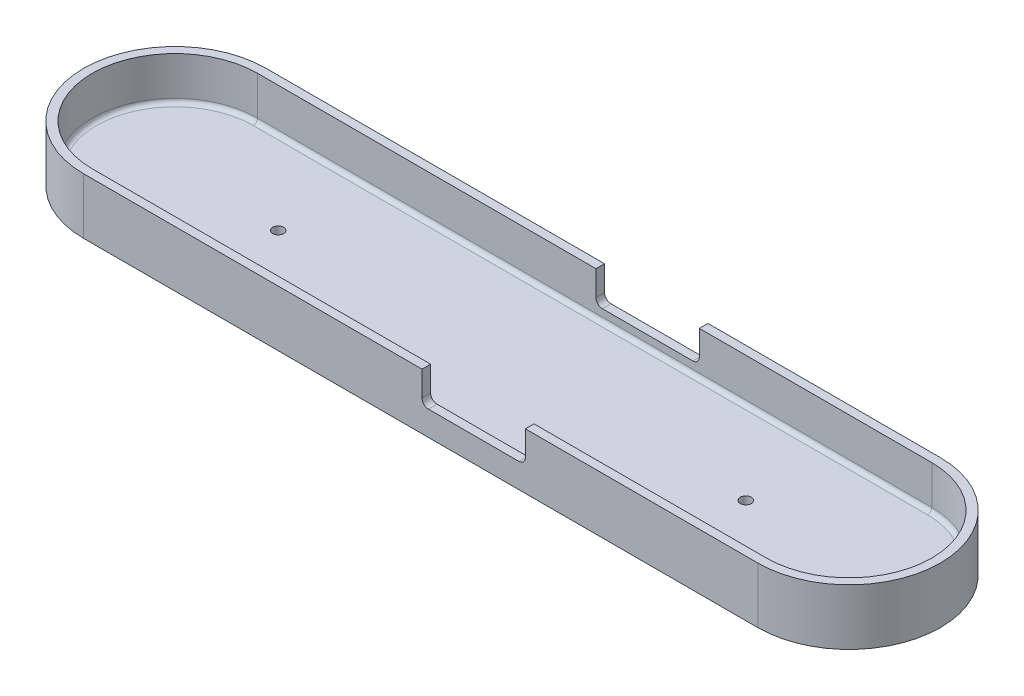
ISO-10303-21;
HEADER;
FILE_DESCRIPTION(('STEP AP214'),'2;1');
FILE_NAME('part.step','',(''),(''),'','','');
FILE_SCHEMA(('AUTOMOTIVE_DESIGN { 1 0 10303 214 1 1 1 1 }'));
ENDSEC;
DATA;
#1=APPLICATION_CONTEXT('core data for automotive mechanical design processes');
#2=APPLICATION_PROTOCOL_DEFINITION('international standard','automotive_design',2000,#1);
#3=PRODUCT_CONTEXT('',#1,'mechanical');
#4=PRODUCT('Part','Part','',(#3));
#5=PRODUCT_RELATED_PRODUCT_CATEGORY('part','',(#4));
#6=PRODUCT_DEFINITION_FORMATION('','',#4);
#7=PRODUCT_DEFINITION_CONTEXT('part definition',#1,'design');
#8=PRODUCT_DEFINITION('design','',#6,#7);
#9=PRODUCT_DEFINITION_SHAPE('','',#8);
#10=(LENGTH_UNIT() NAMED_UNIT(*) SI_UNIT(.MILLI.,.METRE.));
#11=(NAMED_UNIT(*) PLANE_ANGLE_UNIT() SI_UNIT($,.RADIAN.));
#12=(NAMED_UNIT(*) SI_UNIT($,.STERADIAN.) SOLID_ANGLE_UNIT());
#13=UNCERTAINTY_MEASURE_WITH_UNIT(LENGTH_MEASURE(1.E-05),#10,'distance_accuracy_value','');
#14=(GEOMETRIC_REPRESENTATION_CONTEXT(3) GLOBAL_UNCERTAINTY_ASSIGNED_CONTEXT((#13)) GLOBAL_UNIT_ASSIGNED_CONTEXT((#10,
#11,#12)) REPRESENTATION_CONTEXT('',''));
#15=CARTESIAN_POINT('',(0.,0.,0.));
#16=DIRECTION('',(0.,0.,1.));
#17=DIRECTION('',(1.,0.,0.));
#18=AXIS2_PLACEMENT_3D('',#15,#16,#17);
#19=CARTESIAN_POINT('',(-99.441,16.51,26.924));
#20=DIRECTION('',(0.,0.,1.));
#21=DIRECTION('',(1.,0.,0.));
#22=AXIS2_PLACEMENT_3D('',#19,#20,#21);
#23=PLANE('',#22);
#24=DIRECTION('',(0.,1.,0.));
#25=VECTOR('',#24,1.);
#26=CARTESIAN_POINT('',(30.861,7.239,26.924));
#27=LINE('',#26,#25);
#28=CARTESIAN_POINT('',(30.861,9.144,26.924));
#29=VERTEX_POINT('',#28);
#30=CARTESIAN_POINT('',(30.861,16.51,26.924));
#31=VERTEX_POINT('',#30);
#32=EDGE_CURVE('E196',#29,#31,#27,.T.);
#33=ORIENTED_EDGE('',*,*,#32,.F.);
#34=CARTESIAN_POINT('',(28.956,9.144,26.924));
#35=DIRECTION('',(0.,0.,1.));
#36=DIRECTION('',(1.,0.,0.));
#37=AXIS2_PLACEMENT_3D('',#34,#35,#36);
#38=CIRCLE('',#37,1.905);
#39=CARTESIAN_POINT('',(28.956,7.239,26.924));
#40=VERTEX_POINT('',#39);
#41=EDGE_CURVE('E334',#29,#40,#38,.F.);
#42=ORIENTED_EDGE('',*,*,#41,.T.);
#43=DIRECTION('',(-1.,0.,0.));
#44=VECTOR('',#43,1.);
#45=CARTESIAN_POINT('',(30.861,7.239,26.924));
#46=LINE('',#45,#44);
#47=CARTESIAN_POINT('',(2.28600000000001,7.239,26.924));
#48=VERTEX_POINT('',#47);
#49=EDGE_CURVE('E465',#40,#48,#46,.T.);
#50=ORIENTED_EDGE('',*,*,#49,.T.);
#51=CARTESIAN_POINT('',(2.28600000000001,9.144,26.924));
#52=DIRECTION('',(0.,0.,1.));
#53=DIRECTION('',(1.,0.,0.));
#54=AXIS2_PLACEMENT_3D('',#51,#52,#53);
#55=CIRCLE('',#54,1.905);
#56=CARTESIAN_POINT('',(0.381000000000006,9.144,26.924));
#57=VERTEX_POINT('',#56);
#58=EDGE_CURVE('E331',#48,#57,#55,.F.);
#59=ORIENTED_EDGE('',*,*,#58,.T.);
#60=DIRECTION('',(0.,1.,0.));
#61=VECTOR('',#60,1.);
#62=CARTESIAN_POINT('',(0.381000000000006,7.239,26.924));
#63=LINE('',#62,#61);
#64=CARTESIAN_POINT('',(0.381000000000006,16.51,26.924));
#65=VERTEX_POINT('',#64);
#66=EDGE_CURVE('E459',#57,#65,#63,.T.);
#67=ORIENTED_EDGE('',*,*,#66,.T.);
#68=DIRECTION('',(-1.,0.,0.));
#69=VECTOR('',#68,1.);
#70=CARTESIAN_POINT('',(-99.441,16.51,26.924));
#71=LINE('',#70,#69);
#72=CARTESIAN_POINT('',(-99.441,16.51,26.924));
#73=VERTEX_POINT('',#72);
#74=EDGE_CURVE('E226',#65,#73,#71,.T.);
#75=ORIENTED_EDGE('',*,*,#74,.T.);
#76=DIRECTION('',(0.,-1.,0.));
#77=VECTOR('',#76,1.);
#78=CARTESIAN_POINT('',(-99.441,16.51,26.924));
#79=LINE('',#78,#77);
#80=CARTESIAN_POINT('',(-99.441,0.,26.924));
#81=VERTEX_POINT('',#80);
#82=EDGE_CURVE('E254',#73,#81,#79,.T.);
#83=ORIENTED_EDGE('',*,*,#82,.T.);
#84=DIRECTION('',(-1.,0.,0.));
#85=VECTOR('',#84,1.);
#86=CARTESIAN_POINT('',(-99.441,0.,26.924));
#87=LINE('',#86,#85);
#88=CARTESIAN_POINT('',(99.441,0.,26.924));
#89=VERTEX_POINT('',#88);
#90=EDGE_CURVE('E249',#89,#81,#87,.T.);
#91=ORIENTED_EDGE('',*,*,#90,.F.);
#92=DIRECTION('',(0.,-1.,0.));
#93=VECTOR('',#92,1.);
#94=CARTESIAN_POINT('',(99.441,16.51,26.924));
#95=LINE('',#94,#93);
#96=CARTESIAN_POINT('',(99.441,16.51,26.924));
#97=VERTEX_POINT('',#96);
#98=EDGE_CURVE('E222',#97,#89,#95,.T.);
#99=ORIENTED_EDGE('',*,*,#98,.F.);
#100=EDGE_CURVE('E214',#97,#31,#71,.T.);
#101=ORIENTED_EDGE('',*,*,#100,.T.);
#102=EDGE_LOOP('',(#33,#42,#50,#59,#67,#75,#83,#91,#99,#101));
#103=FACE_BOUND('',#102,.T.);
#104=ADVANCED_FACE('F47',(#103),#23,.T.);
#105=CARTESIAN_POINT('',(-99.441,16.51,0.));
#106=DIRECTION('',(0.,-1.,0.));
#107=DIRECTION('',(0.,0.,-1.));
#108=AXIS2_PLACEMENT_3D('',#105,#106,#107);
#109=PLANE('',#108);
#110=DIRECTION('',(0.,0.,-1.));
#111=VECTOR('',#110,1.);
#112=CARTESIAN_POINT('',(0.381000000000006,16.51,26.924));
#113=LINE('',#112,#111);
#114=CARTESIAN_POINT('',(0.381000000000006,16.51,24.384));
#115=VERTEX_POINT('',#114);
#116=EDGE_CURVE('E219',#65,#115,#113,.T.);
#117=ORIENTED_EDGE('',*,*,#116,.T.);
#118=DIRECTION('',(-1.,0.,0.));
#119=VECTOR('',#118,1.);
#120=CARTESIAN_POINT('',(99.441,16.51,24.384));
#121=LINE('',#120,#119);
#122=CARTESIAN_POINT('',(-99.441,16.51,24.384));
#123=VERTEX_POINT('',#122);
#124=EDGE_CURVE('E413',#115,#123,#121,.T.);
#125=ORIENTED_EDGE('',*,*,#124,.T.);
#126=CARTESIAN_POINT('',(-99.441,16.51,0.));
#127=DIRECTION('',(0.,-1.,0.));
#128=DIRECTION('',(0.,0.,-1.));
#129=AXIS2_PLACEMENT_3D('',#126,#127,#128);
#130=CIRCLE('',#129,24.384);
#131=CARTESIAN_POINT('',(-99.441,16.51,-24.384));
#132=VERTEX_POINT('',#131);
#133=EDGE_CURVE('E402',#123,#132,#130,.T.);
#134=ORIENTED_EDGE('',*,*,#133,.T.);
#135=DIRECTION('',(1.,0.,0.));
#136=VECTOR('',#135,1.);
#137=CARTESIAN_POINT('',(99.441,16.51,-24.384));
#138=LINE('',#137,#136);
#139=CARTESIAN_POINT('',(0.381000000000006,16.51,-24.384));
#140=VERTEX_POINT('',#139);
#141=EDGE_CURVE('E407',#132,#140,#138,.T.);
#142=ORIENTED_EDGE('',*,*,#141,.T.);
#143=DIRECTION('',(0.,0.,1.));
#144=VECTOR('',#143,1.);
#145=CARTESIAN_POINT('',(0.381000000000006,16.51,-26.924));
#146=LINE('',#145,#144);
#147=CARTESIAN_POINT('',(0.381000000000006,16.51,-26.924));
#148=VERTEX_POINT('',#147);
#149=EDGE_CURVE('E376',#148,#140,#146,.T.);
#150=ORIENTED_EDGE('',*,*,#149,.F.);
#151=DIRECTION('',(1.,0.,0.));
#152=VECTOR('',#151,1.);
#153=CARTESIAN_POINT('',(-99.441,16.51,-26.924));
#154=LINE('',#153,#152);
#155=CARTESIAN_POINT('',(-99.441,16.51,-26.924));
#156=VERTEX_POINT('',#155);
#157=EDGE_CURVE('E434',#156,#148,#154,.T.);
#158=ORIENTED_EDGE('',*,*,#157,.F.);
#159=CARTESIAN_POINT('',(-99.441,16.51,0.));
#160=DIRECTION('',(0.,-1.,0.));
#161=DIRECTION('',(0.,0.,-1.));
#162=AXIS2_PLACEMENT_3D('',#159,#160,#161);
#163=CIRCLE('',#162,26.924);
#164=EDGE_CURVE('E253',#73,#156,#163,.T.);
#165=ORIENTED_EDGE('',*,*,#164,.F.);
#166=ORIENTED_EDGE('',*,*,#74,.F.);
#167=EDGE_LOOP('',(#117,#125,#134,#142,#150,#158,#165,#166));
#168=FACE_BOUND('',#167,.T.);
#169=ADVANCED_FACE('F454',(#168),#109,.F.);
#170=DIRECTION('',(0.,0.,1.));
#171=VECTOR('',#170,1.);
#172=CARTESIAN_POINT('',(30.861,16.51,24.384));
#173=LINE('',#172,#171);
#174=CARTESIAN_POINT('',(30.861,16.51,24.384));
#175=VERTEX_POINT('',#174);
#176=EDGE_CURVE('E200',#175,#31,#173,.T.);
#177=ORIENTED_EDGE('',*,*,#176,.T.);
#178=ORIENTED_EDGE('',*,*,#100,.F.);
#179=CARTESIAN_POINT('',(99.441,16.51,0.));
#180=DIRECTION('',(0.,-1.,0.));
#181=DIRECTION('',(0.,0.,1.));
#182=AXIS2_PLACEMENT_3D('',#179,#180,#181);
#183=CIRCLE('',#182,26.924);
#184=CARTESIAN_POINT('',(99.441,16.51,-26.924));
#185=VERTEX_POINT('',#184);
#186=EDGE_CURVE('E232',#185,#97,#183,.T.);
#187=ORIENTED_EDGE('',*,*,#186,.F.);
#188=CARTESIAN_POINT('',(30.861,16.51,-26.924));
#189=VERTEX_POINT('',#188);
#190=EDGE_CURVE('E433',#189,#185,#154,.T.);
#191=ORIENTED_EDGE('',*,*,#190,.F.);
#192=DIRECTION('',(0.,0.,-1.));
#193=VECTOR('',#192,1.);
#194=CARTESIAN_POINT('',(30.861,16.51,-24.384));
#195=LINE('',#194,#193);
#196=CARTESIAN_POINT('',(30.861,16.51,-24.384));
#197=VERTEX_POINT('',#196);
#198=EDGE_CURVE('E363',#197,#189,#195,.T.);
#199=ORIENTED_EDGE('',*,*,#198,.F.);
#200=CARTESIAN_POINT('',(99.441,16.51,-24.384));
#201=VERTEX_POINT('',#200);
#202=EDGE_CURVE('E406',#197,#201,#138,.T.);
#203=ORIENTED_EDGE('',*,*,#202,.T.);
#204=CARTESIAN_POINT('',(99.441,16.51,0.));
#205=DIRECTION('',(0.,-1.,0.));
#206=DIRECTION('',(0.,0.,1.));
#207=AXIS2_PLACEMENT_3D('',#204,#205,#206);
#208=CIRCLE('',#207,24.384);
#209=CARTESIAN_POINT('',(99.441,16.51,24.384));
#210=VERTEX_POINT('',#209);
#211=EDGE_CURVE('E410',#201,#210,#208,.T.);
#212=ORIENTED_EDGE('',*,*,#211,.T.);
#213=EDGE_CURVE('E217',#210,#175,#121,.T.);
#214=ORIENTED_EDGE('',*,*,#213,.T.);
#215=EDGE_LOOP('',(#177,#178,#187,#191,#199,#203,#212,#214));
#216=FACE_BOUND('',#215,.T.);
#217=ADVANCED_FACE('F212',(#216),#109,.F.);
#218=CARTESIAN_POINT('',(99.441,16.51,24.384));
#219=DIRECTION('',(0.,0.,1.));
#220=DIRECTION('',(1.,0.,0.));
#221=AXIS2_PLACEMENT_3D('',#218,#219,#220);
#222=PLANE('',#221);
#223=DIRECTION('',(0.,1.,0.));
#224=VECTOR('',#223,1.);
#225=CARTESIAN_POINT('',(0.381000000000006,7.239,24.384));
#226=LINE('',#225,#224);
#227=CARTESIAN_POINT('',(0.381000000000006,9.144,24.384));
#228=VERTEX_POINT('',#227);
#229=EDGE_CURVE('E470',#228,#115,#226,.T.);
#230=ORIENTED_EDGE('',*,*,#229,.F.);
#231=CARTESIAN_POINT('',(2.28600000000001,9.144,24.384));
#232=DIRECTION('',(0.,0.,1.));
#233=DIRECTION('',(1.,0.,0.));
#234=AXIS2_PLACEMENT_3D('',#231,#232,#233);
#235=CIRCLE('',#234,1.905);
#236=CARTESIAN_POINT('',(2.28600000000001,7.239,24.384));
#237=VERTEX_POINT('',#236);
#238=EDGE_CURVE('E328',#228,#237,#235,.T.);
#239=ORIENTED_EDGE('',*,*,#238,.T.);
#240=DIRECTION('',(1.,0.,0.));
#241=VECTOR('',#240,1.);
#242=CARTESIAN_POINT('',(0.381000000000006,7.239,24.384));
#243=LINE('',#242,#241);
#244=CARTESIAN_POINT('',(28.956,7.239,24.384));
#245=VERTEX_POINT('',#244);
#246=EDGE_CURVE('E208',#237,#245,#243,.T.);
#247=ORIENTED_EDGE('',*,*,#246,.T.);
#248=CARTESIAN_POINT('',(28.956,9.144,24.384));
#249=DIRECTION('',(0.,0.,1.));
#250=DIRECTION('',(1.,0.,0.));
#251=AXIS2_PLACEMENT_3D('',#248,#249,#250);
#252=CIRCLE('',#251,1.905);
#253=CARTESIAN_POINT('',(30.861,9.144,24.384));
#254=VERTEX_POINT('',#253);
#255=EDGE_CURVE('E337',#245,#254,#252,.T.);
#256=ORIENTED_EDGE('',*,*,#255,.T.);
#257=DIRECTION('',(0.,1.,0.));
#258=VECTOR('',#257,1.);
#259=CARTESIAN_POINT('',(30.861,7.239,24.384));
#260=LINE('',#259,#258);
#261=EDGE_CURVE('E207',#254,#175,#260,.T.);
#262=ORIENTED_EDGE('',*,*,#261,.T.);
#263=ORIENTED_EDGE('',*,*,#213,.F.);
#264=DIRECTION('',(0.,-1.,0.));
#265=VECTOR('',#264,1.);
#266=CARTESIAN_POINT('',(99.441,16.51,24.384));
#267=LINE('',#266,#265);
#268=CARTESIAN_POINT('',(99.441,5.08,24.384));
#269=VERTEX_POINT('',#268);
#270=EDGE_CURVE('E420',#210,#269,#267,.T.);
#271=ORIENTED_EDGE('',*,*,#270,.T.);
#272=DIRECTION('',(1.,0.,0.));
#273=VECTOR('',#272,1.);
#274=CARTESIAN_POINT('',(99.441,5.08,24.384));
#275=LINE('',#274,#273);
#276=CARTESIAN_POINT('',(-99.441,5.08,24.384));
#277=VERTEX_POINT('',#276);
#278=EDGE_CURVE('E278',#269,#277,#275,.F.);
#279=ORIENTED_EDGE('',*,*,#278,.T.);
#280=DIRECTION('',(0.,-1.,0.));
#281=VECTOR('',#280,1.);
#282=CARTESIAN_POINT('',(-99.441,16.51,24.384));
#283=LINE('',#282,#281);
#284=EDGE_CURVE('E241',#123,#277,#283,.T.);
#285=ORIENTED_EDGE('',*,*,#284,.F.);
#286=ORIENTED_EDGE('',*,*,#124,.F.);
#287=EDGE_LOOP('',(#230,#239,#247,#256,#262,#263,#271,#279,#285,#286));
#288=FACE_BOUND('',#287,.T.);
#289=ADVANCED_FACE('F469',(#288),#222,.F.);
#290=CARTESIAN_POINT('',(-99.441,3.81,0.));
#291=DIRECTION('',(0.,1.,0.));
#292=DIRECTION('',(0.,0.,1.));
#293=AXIS2_PLACEMENT_3D('',#290,#291,#292);
#294=PLANE('',#293);
#295=DIRECTION('',(1.,0.,0.));
#296=VECTOR('',#295,1.);
#297=CARTESIAN_POINT('',(-99.441,3.81,23.114));
#298=LINE('',#297,#296);
#299=CARTESIAN_POINT('',(-99.441,3.81,23.114));
#300=VERTEX_POINT('',#299);
#301=CARTESIAN_POINT('',(99.441,3.81,23.114));
#302=VERTEX_POINT('',#301);
#303=EDGE_CURVE('E267',#300,#302,#298,.T.);
#304=ORIENTED_EDGE('',*,*,#303,.T.);
#305=CARTESIAN_POINT('',(99.441,3.81,0.));
#306=DIRECTION('',(0.,1.,0.));
#307=DIRECTION('',(0.,0.,1.));
#308=AXIS2_PLACEMENT_3D('',#305,#306,#307);
#309=CIRCLE('',#308,23.114);
#310=CARTESIAN_POINT('',(99.441,3.81,-23.114));
#311=VERTEX_POINT('',#310);
#312=EDGE_CURVE('E270',#302,#311,#309,.T.);
#313=ORIENTED_EDGE('',*,*,#312,.T.);
#314=DIRECTION('',(-1.,0.,0.));
#315=VECTOR('',#314,1.);
#316=CARTESIAN_POINT('',(-99.441,3.81,-23.114));
#317=LINE('',#316,#315);
#318=CARTESIAN_POINT('',(-99.441,3.81,-23.114));
#319=VERTEX_POINT('',#318);
#320=EDGE_CURVE('E257',#311,#319,#317,.T.);
#321=ORIENTED_EDGE('',*,*,#320,.T.);
#322=CARTESIAN_POINT('',(-99.441,3.81,0.));
#323=DIRECTION('',(0.,1.,0.));
#324=DIRECTION('',(0.,0.,1.));
#325=AXIS2_PLACEMENT_3D('',#322,#323,#324);
#326=CIRCLE('',#325,23.114);
#327=EDGE_CURVE('E264',#319,#300,#326,.T.);
#328=ORIENTED_EDGE('',*,*,#327,.T.);
#329=EDGE_LOOP('',(#304,#313,#321,#328));
#330=FACE_BOUND('',#329,.T.);
#331=CARTESIAN_POINT('',(-68.961,3.81,0.));
#332=DIRECTION('',(0.,1.,0.));
#333=DIRECTION('',(0.,0.,1.));
#334=AXIS2_PLACEMENT_3D('',#331,#332,#333);
#335=CIRCLE('',#334,1.6256);
#336=CARTESIAN_POINT('',(-68.961,3.81,1.6256));
#337=VERTEX_POINT('',#336);
#338=EDGE_CURVE('E398',#337,#337,#335,.T.);
#339=ORIENTED_EDGE('',*,*,#338,.F.);
#340=EDGE_LOOP('',(#339));
#341=FACE_BOUND('',#340,.T.);
#342=CARTESIAN_POINT('',(68.961,3.81,0.));
#343=DIRECTION('',(0.,1.,0.));
#344=DIRECTION('',(0.,0.,1.));
#345=AXIS2_PLACEMENT_3D('',#342,#343,#344);
#346=CIRCLE('',#345,1.6256);
#347=CARTESIAN_POINT('',(68.961,3.81,1.6256));
#348=VERTEX_POINT('',#347);
#349=EDGE_CURVE('E391',#348,#348,#346,.T.);
#350=ORIENTED_EDGE('',*,*,#349,.F.);
#351=EDGE_LOOP('',(#350));
#352=FACE_BOUND('',#351,.T.);
#353=ADVANCED_FACE('F529',(#330,#341,#352),#294,.T.);
#354=CARTESIAN_POINT('',(-99.441,16.51,0.));
#355=DIRECTION('',(0.,-1.,0.));
#356=DIRECTION('',(0.,0.,-1.));
#357=AXIS2_PLACEMENT_3D('',#354,#355,#356);
#358=CYLINDRICAL_SURFACE('',#357,26.924);
#359=CARTESIAN_POINT('',(-99.441,0.,0.));
#360=DIRECTION('',(0.,-1.,0.));
#361=DIRECTION('',(0.,0.,-1.));
#362=AXIS2_PLACEMENT_3D('',#359,#360,#361);
#363=CIRCLE('',#362,26.924);
#364=CARTESIAN_POINT('',(-99.441,0.,-26.924));
#365=VERTEX_POINT('',#364);
#366=EDGE_CURVE('E236',#81,#365,#363,.T.);
#367=ORIENTED_EDGE('',*,*,#366,.F.);
#368=ORIENTED_EDGE('',*,*,#82,.F.);
#369=ORIENTED_EDGE('',*,*,#164,.T.);
#370=DIRECTION('',(0.,-1.,0.));
#371=VECTOR('',#370,1.);
#372=CARTESIAN_POINT('',(-99.441,16.51,-26.924));
#373=LINE('',#372,#371);
#374=EDGE_CURVE('E225',#156,#365,#373,.T.);
#375=ORIENTED_EDGE('',*,*,#374,.T.);
#376=EDGE_LOOP('',(#367,#368,#369,#375));
#377=FACE_BOUND('',#376,.T.);
#378=ADVANCED_FACE('F457',(#377),#358,.T.);
#379=CARTESIAN_POINT('',(99.441,16.51,0.));
#380=DIRECTION('',(0.,-1.,0.));
#381=DIRECTION('',(0.,0.,-1.));
#382=AXIS2_PLACEMENT_3D('',#379,#380,#381);
#383=CYLINDRICAL_SURFACE('',#382,26.924);
#384=CARTESIAN_POINT('',(99.441,0.,0.));
#385=DIRECTION('',(0.,-1.,0.));
#386=DIRECTION('',(0.,0.,1.));
#387=AXIS2_PLACEMENT_3D('',#384,#385,#386);
#388=CIRCLE('',#387,26.924);
#389=CARTESIAN_POINT('',(99.441,0.,-26.924));
#390=VERTEX_POINT('',#389);
#391=EDGE_CURVE('E245',#390,#89,#388,.T.);
#392=ORIENTED_EDGE('',*,*,#391,.F.);
#393=DIRECTION('',(0.,-1.,0.));
#394=VECTOR('',#393,1.);
#395=CARTESIAN_POINT('',(99.441,16.51,-26.924));
#396=LINE('',#395,#394);
#397=EDGE_CURVE('E230',#185,#390,#396,.T.);
#398=ORIENTED_EDGE('',*,*,#397,.F.);
#399=ORIENTED_EDGE('',*,*,#186,.T.);
#400=ORIENTED_EDGE('',*,*,#98,.T.);
#401=EDGE_LOOP('',(#392,#398,#399,#400));
#402=FACE_BOUND('',#401,.T.);
#403=ADVANCED_FACE('F446',(#402),#383,.T.);
#404=CARTESIAN_POINT('',(-99.441,16.51,-26.924));
#405=DIRECTION('',(0.,0.,-1.));
#406=DIRECTION('',(-1.,0.,0.));
#407=AXIS2_PLACEMENT_3D('',#404,#405,#406);
#408=PLANE('',#407);
#409=DIRECTION('',(-1.,0.,0.));
#410=VECTOR('',#409,1.);
#411=CARTESIAN_POINT('',(30.861,7.239,-26.924));
#412=LINE('',#411,#410);
#413=CARTESIAN_POINT('',(28.956,7.239,-26.924));
#414=VERTEX_POINT('',#413);
#415=CARTESIAN_POINT('',(2.28600000000001,7.239,-26.924));
#416=VERTEX_POINT('',#415);
#417=EDGE_CURVE('E350',#414,#416,#412,.T.);
#418=ORIENTED_EDGE('',*,*,#417,.F.);
#419=CARTESIAN_POINT('',(28.956,9.144,-26.924));
#420=DIRECTION('',(0.,0.,-1.));
#421=DIRECTION('',(-1.,0.,0.));
#422=AXIS2_PLACEMENT_3D('',#419,#420,#421);
#423=CIRCLE('',#422,1.905);
#424=CARTESIAN_POINT('',(30.861,9.144,-26.924));
#425=VERTEX_POINT('',#424);
#426=EDGE_CURVE('E56',#414,#425,#423,.F.);
#427=ORIENTED_EDGE('',*,*,#426,.T.);
#428=DIRECTION('',(0.,1.,0.));
#429=VECTOR('',#428,1.);
#430=CARTESIAN_POINT('',(30.861,7.239,-26.924));
#431=LINE('',#430,#429);
#432=EDGE_CURVE('E292',#425,#189,#431,.T.);
#433=ORIENTED_EDGE('',*,*,#432,.T.);
#434=ORIENTED_EDGE('',*,*,#190,.T.);
#435=ORIENTED_EDGE('',*,*,#397,.T.);
#436=DIRECTION('',(1.,0.,0.));
#437=VECTOR('',#436,1.);
#438=CARTESIAN_POINT('',(-99.441,0.,-26.924));
#439=LINE('',#438,#437);
#440=EDGE_CURVE('E240',#365,#390,#439,.T.);
#441=ORIENTED_EDGE('',*,*,#440,.F.);
#442=ORIENTED_EDGE('',*,*,#374,.F.);
#443=ORIENTED_EDGE('',*,*,#157,.T.);
#444=DIRECTION('',(0.,1.,0.));
#445=VECTOR('',#444,1.);
#446=CARTESIAN_POINT('',(0.381000000000006,7.239,-26.924));
#447=LINE('',#446,#445);
#448=CARTESIAN_POINT('',(0.381000000000006,9.144,-26.924));
#449=VERTEX_POINT('',#448);
#450=EDGE_CURVE('E352',#449,#148,#447,.T.);
#451=ORIENTED_EDGE('',*,*,#450,.F.);
#452=CARTESIAN_POINT('',(2.28600000000001,9.144,-26.924));
#453=DIRECTION('',(0.,0.,-1.));
#454=DIRECTION('',(-1.,0.,0.));
#455=AXIS2_PLACEMENT_3D('',#452,#453,#454);
#456=CIRCLE('',#455,1.905);
#457=EDGE_CURVE('E343',#449,#416,#456,.F.);
#458=ORIENTED_EDGE('',*,*,#457,.T.);
#459=EDGE_LOOP('',(#418,#427,#433,#434,#435,#441,#442,#443,#451,#458));
#460=FACE_BOUND('',#459,.T.);
#461=ADVANCED_FACE('F349',(#460),#408,.T.);
#462=CARTESIAN_POINT('',(-99.441,16.51,0.));
#463=DIRECTION('',(0.,-1.,0.));
#464=DIRECTION('',(0.,0.,-1.));
#465=AXIS2_PLACEMENT_3D('',#462,#463,#464);
#466=CYLINDRICAL_SURFACE('',#465,24.384);
#467=ORIENTED_EDGE('',*,*,#284,.T.);
#468=CARTESIAN_POINT('',(-99.441,5.08,0.));
#469=DIRECTION('',(0.,1.,0.));
#470=DIRECTION('',(0.,0.,1.));
#471=AXIS2_PLACEMENT_3D('',#468,#469,#470);
#472=CIRCLE('',#471,24.384);
#473=CARTESIAN_POINT('',(-99.441,5.08,-24.384));
#474=VERTEX_POINT('',#473);
#475=EDGE_CURVE('E281',#277,#474,#472,.F.);
#476=ORIENTED_EDGE('',*,*,#475,.T.);
#477=DIRECTION('',(0.,-1.,0.));
#478=VECTOR('',#477,1.);
#479=CARTESIAN_POINT('',(-99.441,16.51,-24.384));
#480=LINE('',#479,#478);
#481=EDGE_CURVE('E416',#132,#474,#480,.T.);
#482=ORIENTED_EDGE('',*,*,#481,.F.);
#483=ORIENTED_EDGE('',*,*,#133,.F.);
#484=EDGE_LOOP('',(#467,#476,#482,#483));
#485=FACE_BOUND('',#484,.T.);
#486=ADVANCED_FACE('F526',(#485),#466,.F.);
#487=CARTESIAN_POINT('',(99.441,16.51,0.));
#488=DIRECTION('',(0.,-1.,0.));
#489=DIRECTION('',(0.,0.,-1.));
#490=AXIS2_PLACEMENT_3D('',#487,#488,#489);
#491=CYLINDRICAL_SURFACE('',#490,24.384);
#492=DIRECTION('',(0.,-1.,0.));
#493=VECTOR('',#492,1.);
#494=CARTESIAN_POINT('',(99.441,16.51,-24.384));
#495=LINE('',#494,#493);
#496=CARTESIAN_POINT('',(99.441,5.08,-24.384));
#497=VERTEX_POINT('',#496);
#498=EDGE_CURVE('E424',#201,#497,#495,.T.);
#499=ORIENTED_EDGE('',*,*,#498,.T.);
#500=CARTESIAN_POINT('',(99.441,5.08,0.));
#501=DIRECTION('',(0.,1.,0.));
#502=DIRECTION('',(0.,0.,1.));
#503=AXIS2_PLACEMENT_3D('',#500,#501,#502);
#504=CIRCLE('',#503,24.384);
#505=EDGE_CURVE('E274',#497,#269,#504,.F.);
#506=ORIENTED_EDGE('',*,*,#505,.T.);
#507=ORIENTED_EDGE('',*,*,#270,.F.);
#508=ORIENTED_EDGE('',*,*,#211,.F.);
#509=EDGE_LOOP('',(#499,#506,#507,#508));
#510=FACE_BOUND('',#509,.T.);
#511=ADVANCED_FACE('F571',(#510),#491,.F.);
#512=CARTESIAN_POINT('',(99.441,16.51,-24.384));
#513=DIRECTION('',(0.,0.,-1.));
#514=DIRECTION('',(-1.,0.,0.));
#515=AXIS2_PLACEMENT_3D('',#512,#513,#514);
#516=PLANE('',#515);
#517=ORIENTED_EDGE('',*,*,#202,.F.);
#518=DIRECTION('',(0.,1.,0.));
#519=VECTOR('',#518,1.);
#520=CARTESIAN_POINT('',(30.861,7.239,-24.384));
#521=LINE('',#520,#519);
#522=CARTESIAN_POINT('',(30.861,9.144,-24.384));
#523=VERTEX_POINT('',#522);
#524=EDGE_CURVE('E379',#523,#197,#521,.T.);
#525=ORIENTED_EDGE('',*,*,#524,.F.);
#526=CARTESIAN_POINT('',(28.956,9.144,-24.384));
#527=DIRECTION('',(0.,0.,-1.));
#528=DIRECTION('',(-1.,0.,0.));
#529=AXIS2_PLACEMENT_3D('',#526,#527,#528);
#530=CIRCLE('',#529,1.905);
#531=CARTESIAN_POINT('',(28.956,7.239,-24.384));
#532=VERTEX_POINT('',#531);
#533=EDGE_CURVE('E11',#523,#532,#530,.T.);
#534=ORIENTED_EDGE('',*,*,#533,.T.);
#535=DIRECTION('',(1.,0.,0.));
#536=VECTOR('',#535,1.);
#537=CARTESIAN_POINT('',(0.381000000000006,7.239,-24.384));
#538=LINE('',#537,#536);
#539=CARTESIAN_POINT('',(2.28600000000001,7.239,-24.384));
#540=VERTEX_POINT('',#539);
#541=EDGE_CURVE('E362',#540,#532,#538,.T.);
#542=ORIENTED_EDGE('',*,*,#541,.F.);
#543=CARTESIAN_POINT('',(2.28600000000001,9.144,-24.384));
#544=DIRECTION('',(0.,0.,-1.));
#545=DIRECTION('',(-1.,0.,0.));
#546=AXIS2_PLACEMENT_3D('',#543,#544,#545);
#547=CIRCLE('',#546,1.905);
#548=CARTESIAN_POINT('',(0.381000000000006,9.144,-24.384));
#549=VERTEX_POINT('',#548);
#550=EDGE_CURVE('E340',#540,#549,#547,.T.);
#551=ORIENTED_EDGE('',*,*,#550,.T.);
#552=DIRECTION('',(0.,1.,0.));
#553=VECTOR('',#552,1.);
#554=CARTESIAN_POINT('',(0.381000000000006,7.239,-24.384));
#555=LINE('',#554,#553);
#556=EDGE_CURVE('E371',#549,#140,#555,.T.);
#557=ORIENTED_EDGE('',*,*,#556,.T.);
#558=ORIENTED_EDGE('',*,*,#141,.F.);
#559=ORIENTED_EDGE('',*,*,#481,.T.);
#560=DIRECTION('',(-1.,0.,0.));
#561=VECTOR('',#560,1.);
#562=CARTESIAN_POINT('',(99.441,5.08,-24.384));
#563=LINE('',#562,#561);
#564=EDGE_CURVE('E284',#474,#497,#563,.F.);
#565=ORIENTED_EDGE('',*,*,#564,.T.);
#566=ORIENTED_EDGE('',*,*,#498,.F.);
#567=EDGE_LOOP('',(#517,#525,#534,#542,#551,#557,#558,#559,#565,#566));
#568=FACE_BOUND('',#567,.T.);
#569=ADVANCED_FACE('F369',(#568),#516,.F.);
#570=CARTESIAN_POINT('',(-99.441,0.,0.));
#571=DIRECTION('',(0.,1.,0.));
#572=DIRECTION('',(0.,0.,1.));
#573=AXIS2_PLACEMENT_3D('',#570,#571,#572);
#574=PLANE('',#573);
#575=CARTESIAN_POINT('',(-68.961,0.,0.));
#576=DIRECTION('',(0.,-1.,0.));
#577=DIRECTION('',(0.,0.,-1.));
#578=AXIS2_PLACEMENT_3D('',#575,#576,#577);
#579=CIRCLE('',#578,1.6256);
#580=CARTESIAN_POINT('',(-68.961,0.,-1.6256));
#581=VERTEX_POINT('',#580);
#582=EDGE_CURVE('E387',#581,#581,#579,.T.);
#583=ORIENTED_EDGE('',*,*,#582,.F.);
#584=EDGE_LOOP('',(#583));
#585=FACE_BOUND('',#584,.T.);
#586=CARTESIAN_POINT('',(68.961,0.,0.));
#587=DIRECTION('',(0.,-1.,0.));
#588=DIRECTION('',(0.,0.,-1.));
#589=AXIS2_PLACEMENT_3D('',#586,#587,#588);
#590=CIRCLE('',#589,1.6256);
#591=CARTESIAN_POINT('',(68.961,0.,-1.6256));
#592=VERTEX_POINT('',#591);
#593=EDGE_CURVE('E303',#592,#592,#590,.T.);
#594=ORIENTED_EDGE('',*,*,#593,.F.);
#595=EDGE_LOOP('',(#594));
#596=FACE_BOUND('',#595,.T.);
#597=ORIENTED_EDGE('',*,*,#366,.T.);
#598=ORIENTED_EDGE('',*,*,#440,.T.);
#599=ORIENTED_EDGE('',*,*,#391,.T.);
#600=ORIENTED_EDGE('',*,*,#90,.T.);
#601=EDGE_LOOP('',(#597,#598,#599,#600));
#602=FACE_BOUND('',#601,.T.);
#603=ADVANCED_FACE('F448',(#585,#596,#602),#574,.F.);
#604=CARTESIAN_POINT('',(68.961,16.51,0.));
#605=DIRECTION('',(0.,-1.,0.));
#606=DIRECTION('',(0.,0.,-1.));
#607=AXIS2_PLACEMENT_3D('',#604,#605,#606);
#608=CYLINDRICAL_SURFACE('',#607,1.6256);
#609=ORIENTED_EDGE('',*,*,#349,.T.);
#610=EDGE_LOOP('',(#609));
#611=FACE_BOUND('',#610,.T.);
#612=ORIENTED_EDGE('',*,*,#593,.T.);
#613=EDGE_LOOP('',(#612));
#614=FACE_BOUND('',#613,.T.);
#615=ADVANCED_FACE('F535',(#611,#614),#608,.F.);
#616=CARTESIAN_POINT('',(-68.961,16.51,0.));
#617=DIRECTION('',(0.,-1.,0.));
#618=DIRECTION('',(0.,0.,-1.));
#619=AXIS2_PLACEMENT_3D('',#616,#617,#618);
#620=CYLINDRICAL_SURFACE('',#619,1.6256);
#621=ORIENTED_EDGE('',*,*,#338,.T.);
#622=EDGE_LOOP('',(#621));
#623=FACE_BOUND('',#622,.T.);
#624=ORIENTED_EDGE('',*,*,#582,.T.);
#625=EDGE_LOOP('',(#624));
#626=FACE_BOUND('',#625,.T.);
#627=ADVANCED_FACE('F553',(#623,#626),#620,.F.);
#628=CARTESIAN_POINT('',(-99.441,5.08,0.));
#629=DIRECTION('',(0.,1.,0.));
#630=DIRECTION('',(0.,0.,1.));
#631=AXIS2_PLACEMENT_3D('',#628,#629,#630);
#632=TOROIDAL_SURFACE('',#631,23.114,1.27);
#633=CARTESIAN_POINT('',(-99.441,5.08,-23.114));
#634=DIRECTION('',(-1.,0.,0.));
#635=DIRECTION('',(0.,0.,1.));
#636=AXIS2_PLACEMENT_3D('',#633,#634,#635);
#637=CIRCLE('',#636,1.27);
#638=EDGE_CURVE('E295',#474,#319,#637,.T.);
#639=ORIENTED_EDGE('',*,*,#638,.F.);
#640=ORIENTED_EDGE('',*,*,#475,.F.);
#641=CARTESIAN_POINT('',(-99.441,5.08,23.114));
#642=DIRECTION('',(-1.,0.,0.));
#643=DIRECTION('',(0.,0.,1.));
#644=AXIS2_PLACEMENT_3D('',#641,#642,#643);
#645=CIRCLE('',#644,1.27);
#646=EDGE_CURVE('E299',#300,#277,#645,.T.);
#647=ORIENTED_EDGE('',*,*,#646,.F.);
#648=ORIENTED_EDGE('',*,*,#327,.F.);
#649=EDGE_LOOP('',(#639,#640,#647,#648));
#650=FACE_BOUND('',#649,.T.);
#651=ADVANCED_FACE('F549',(#650),#632,.F.);
#652=CARTESIAN_POINT('',(-99.441,5.08,23.114));
#653=DIRECTION('',(1.,0.,0.));
#654=DIRECTION('',(0.,0.,-1.));
#655=AXIS2_PLACEMENT_3D('',#652,#653,#654);
#656=CYLINDRICAL_SURFACE('',#655,1.27);
#657=ORIENTED_EDGE('',*,*,#646,.T.);
#658=ORIENTED_EDGE('',*,*,#278,.F.);
#659=CARTESIAN_POINT('',(99.441,5.08,23.114));
#660=DIRECTION('',(-1.,0.,0.));
#661=DIRECTION('',(0.,0.,1.));
#662=AXIS2_PLACEMENT_3D('',#659,#660,#661);
#663=CIRCLE('',#662,1.27);
#664=EDGE_CURVE('E291',#302,#269,#663,.T.);
#665=ORIENTED_EDGE('',*,*,#664,.F.);
#666=ORIENTED_EDGE('',*,*,#303,.F.);
#667=EDGE_LOOP('',(#657,#658,#665,#666));
#668=FACE_BOUND('',#667,.T.);
#669=ADVANCED_FACE('F545',(#668),#656,.F.);
#670=CARTESIAN_POINT('',(-99.441,5.08,-23.114));
#671=DIRECTION('',(-1.,0.,0.));
#672=DIRECTION('',(0.,0.,1.));
#673=AXIS2_PLACEMENT_3D('',#670,#671,#672);
#674=CYLINDRICAL_SURFACE('',#673,1.27);
#675=ORIENTED_EDGE('',*,*,#638,.T.);
#676=ORIENTED_EDGE('',*,*,#320,.F.);
#677=CARTESIAN_POINT('',(99.441,5.08,-23.114));
#678=DIRECTION('',(-1.,0.,0.));
#679=DIRECTION('',(0.,0.,1.));
#680=AXIS2_PLACEMENT_3D('',#677,#678,#679);
#681=CIRCLE('',#680,1.27);
#682=EDGE_CURVE('E288',#497,#311,#681,.T.);
#683=ORIENTED_EDGE('',*,*,#682,.F.);
#684=ORIENTED_EDGE('',*,*,#564,.F.);
#685=EDGE_LOOP('',(#675,#676,#683,#684));
#686=FACE_BOUND('',#685,.T.);
#687=ADVANCED_FACE('F541',(#686),#674,.F.);
#688=CARTESIAN_POINT('',(99.441,5.08,0.));
#689=DIRECTION('',(0.,1.,0.));
#690=DIRECTION('',(0.,0.,1.));
#691=AXIS2_PLACEMENT_3D('',#688,#689,#690);
#692=TOROIDAL_SURFACE('',#691,23.114,1.27);
#693=ORIENTED_EDGE('',*,*,#664,.T.);
#694=ORIENTED_EDGE('',*,*,#505,.F.);
#695=ORIENTED_EDGE('',*,*,#682,.T.);
#696=ORIENTED_EDGE('',*,*,#312,.F.);
#697=EDGE_LOOP('',(#693,#694,#695,#696));
#698=FACE_BOUND('',#697,.T.);
#699=ADVANCED_FACE('F537',(#698),#692,.F.);
#700=CARTESIAN_POINT('',(30.861,7.239,-24.384));
#701=DIRECTION('',(1.,0.,0.));
#702=DIRECTION('',(0.,0.,-1.));
#703=AXIS2_PLACEMENT_3D('',#700,#701,#702);
#704=PLANE('',#703);
#705=ORIENTED_EDGE('',*,*,#432,.F.);
#706=DIRECTION('',(0.,0.,-1.));
#707=VECTOR('',#706,1.);
#708=CARTESIAN_POINT('',(30.861,9.144,-24.384));
#709=LINE('',#708,#707);
#710=EDGE_CURVE('E63',#425,#523,#709,.F.);
#711=ORIENTED_EDGE('',*,*,#710,.T.);
#712=ORIENTED_EDGE('',*,*,#524,.T.);
#713=ORIENTED_EDGE('',*,*,#198,.T.);
#714=EDGE_LOOP('',(#705,#711,#712,#713));
#715=FACE_BOUND('',#714,.T.);
#716=ADVANCED_FACE('F540',(#715),#704,.F.);
#717=CARTESIAN_POINT('',(0.381000000000006,7.239,-26.924));
#718=DIRECTION('',(-1.,0.,0.));
#719=DIRECTION('',(0.,0.,1.));
#720=AXIS2_PLACEMENT_3D('',#717,#718,#719);
#721=PLANE('',#720);
#722=ORIENTED_EDGE('',*,*,#556,.F.);
#723=DIRECTION('',(0.,0.,1.));
#724=VECTOR('',#723,1.);
#725=CARTESIAN_POINT('',(0.381000000000006,9.144,-26.924));
#726=LINE('',#725,#724);
#727=EDGE_CURVE('E323',#549,#449,#726,.F.);
#728=ORIENTED_EDGE('',*,*,#727,.T.);
#729=ORIENTED_EDGE('',*,*,#450,.T.);
#730=ORIENTED_EDGE('',*,*,#149,.T.);
#731=EDGE_LOOP('',(#722,#728,#729,#730));
#732=FACE_BOUND('',#731,.T.);
#733=ADVANCED_FACE('F374',(#732),#721,.F.);
#734=CARTESIAN_POINT('',(0.,7.239,0.));
#735=DIRECTION('',(0.,1.,0.));
#736=DIRECTION('',(0.,0.,1.));
#737=AXIS2_PLACEMENT_3D('',#734,#735,#736);
#738=PLANE('',#737);
#739=ORIENTED_EDGE('',*,*,#417,.T.);
#740=DIRECTION('',(0.,0.,1.));
#741=VECTOR('',#740,1.);
#742=CARTESIAN_POINT('',(2.28600000000001,7.239,0.));
#743=LINE('',#742,#741);
#744=EDGE_CURVE('E319',#416,#540,#743,.T.);
#745=ORIENTED_EDGE('',*,*,#744,.T.);
#746=ORIENTED_EDGE('',*,*,#541,.T.);
#747=DIRECTION('',(0.,0.,-1.));
#748=VECTOR('',#747,1.);
#749=CARTESIAN_POINT('',(28.956,7.239,0.));
#750=LINE('',#749,#748);
#751=EDGE_CURVE('E315',#532,#414,#750,.T.);
#752=ORIENTED_EDGE('',*,*,#751,.T.);
#753=EDGE_LOOP('',(#739,#745,#746,#752));
#754=FACE_BOUND('',#753,.T.);
#755=ADVANCED_FACE('F357',(#754),#738,.T.);
#756=CARTESIAN_POINT('',(0.381000000000006,7.239,26.924));
#757=DIRECTION('',(1.,0.,0.));
#758=DIRECTION('',(0.,0.,-1.));
#759=AXIS2_PLACEMENT_3D('',#756,#757,#758);
#760=PLANE('',#759);
#761=ORIENTED_EDGE('',*,*,#66,.F.);
#762=DIRECTION('',(0.,0.,-1.));
#763=VECTOR('',#762,1.);
#764=CARTESIAN_POINT('',(0.381000000000006,9.144,24.384));
#765=LINE('',#764,#763);
#766=EDGE_CURVE('E287',#57,#228,#765,.T.);
#767=ORIENTED_EDGE('',*,*,#766,.T.);
#768=ORIENTED_EDGE('',*,*,#229,.T.);
#769=ORIENTED_EDGE('',*,*,#116,.F.);
#770=EDGE_LOOP('',(#761,#767,#768,#769));
#771=FACE_BOUND('',#770,.T.);
#772=ADVANCED_FACE('F501',(#771),#760,.T.);
#773=CARTESIAN_POINT('',(30.861,7.239,24.384));
#774=DIRECTION('',(-1.,0.,0.));
#775=DIRECTION('',(0.,0.,1.));
#776=AXIS2_PLACEMENT_3D('',#773,#774,#775);
#777=PLANE('',#776);
#778=ORIENTED_EDGE('',*,*,#261,.F.);
#779=DIRECTION('',(0.,0.,1.));
#780=VECTOR('',#779,1.);
#781=CARTESIAN_POINT('',(30.861,9.144,26.924));
#782=LINE('',#781,#780);
#783=EDGE_CURVE('E203',#254,#29,#782,.T.);
#784=ORIENTED_EDGE('',*,*,#783,.T.);
#785=ORIENTED_EDGE('',*,*,#32,.T.);
#786=ORIENTED_EDGE('',*,*,#176,.F.);
#787=EDGE_LOOP('',(#778,#784,#785,#786));
#788=FACE_BOUND('',#787,.T.);
#789=ADVANCED_FACE('F199',(#788),#777,.T.);
#790=CARTESIAN_POINT('',(0.,7.239,0.));
#791=DIRECTION('',(0.,1.,0.));
#792=DIRECTION('',(0.,0.,-1.));
#793=AXIS2_PLACEMENT_3D('',#790,#791,#792);
#794=PLANE('',#793);
#795=ORIENTED_EDGE('',*,*,#246,.F.);
#796=DIRECTION('',(0.,0.,-1.));
#797=VECTOR('',#796,1.);
#798=CARTESIAN_POINT('',(2.28600000000001,7.239,26.924));
#799=LINE('',#798,#797);
#800=EDGE_CURVE('E310',#237,#48,#799,.F.);
#801=ORIENTED_EDGE('',*,*,#800,.T.);
#802=ORIENTED_EDGE('',*,*,#49,.F.);
#803=DIRECTION('',(0.,0.,1.));
#804=VECTOR('',#803,1.);
#805=CARTESIAN_POINT('',(28.956,7.239,24.384));
#806=LINE('',#805,#804);
#807=EDGE_CURVE('E307',#40,#245,#806,.F.);
#808=ORIENTED_EDGE('',*,*,#807,.T.);
#809=EDGE_LOOP('',(#795,#801,#802,#808));
#810=FACE_BOUND('',#809,.T.);
#811=ADVANCED_FACE('F508',(#810),#794,.T.);
#812=CARTESIAN_POINT('',(2.28600000000001,9.144,26.924));
#813=DIRECTION('',(0.,0.,1.));
#814=DIRECTION('',(1.,0.,0.));
#815=AXIS2_PLACEMENT_3D('',#812,#813,#814);
#816=CYLINDRICAL_SURFACE('',#815,1.905);
#817=ORIENTED_EDGE('',*,*,#58,.F.);
#818=ORIENTED_EDGE('',*,*,#800,.F.);
#819=ORIENTED_EDGE('',*,*,#238,.F.);
#820=ORIENTED_EDGE('',*,*,#766,.F.);
#821=EDGE_LOOP('',(#817,#818,#819,#820));
#822=FACE_BOUND('',#821,.T.);
#823=ADVANCED_FACE('F500',(#822),#816,.F.);
#824=CARTESIAN_POINT('',(28.956,9.144,24.384));
#825=DIRECTION('',(0.,0.,-1.));
#826=DIRECTION('',(-1.,0.,0.));
#827=AXIS2_PLACEMENT_3D('',#824,#825,#826);
#828=CYLINDRICAL_SURFACE('',#827,1.905);
#829=ORIENTED_EDGE('',*,*,#255,.F.);
#830=ORIENTED_EDGE('',*,*,#807,.F.);
#831=ORIENTED_EDGE('',*,*,#41,.F.);
#832=ORIENTED_EDGE('',*,*,#783,.F.);
#833=EDGE_LOOP('',(#829,#830,#831,#832));
#834=FACE_BOUND('',#833,.T.);
#835=ADVANCED_FACE('F557',(#834),#828,.F.);
#836=CARTESIAN_POINT('',(2.28600000000001,9.144,0.));
#837=DIRECTION('',(0.,0.,1.));
#838=DIRECTION('',(1.,0.,0.));
#839=AXIS2_PLACEMENT_3D('',#836,#837,#838);
#840=CYLINDRICAL_SURFACE('',#839,1.905);
#841=ORIENTED_EDGE('',*,*,#457,.F.);
#842=ORIENTED_EDGE('',*,*,#727,.F.);
#843=ORIENTED_EDGE('',*,*,#550,.F.);
#844=ORIENTED_EDGE('',*,*,#744,.F.);
#845=EDGE_LOOP('',(#841,#842,#843,#844));
#846=FACE_BOUND('',#845,.T.);
#847=ADVANCED_FACE('F365',(#846),#840,.F.);
#848=CARTESIAN_POINT('',(28.956,9.144,0.));
#849=DIRECTION('',(0.,0.,-1.));
#850=DIRECTION('',(-1.,0.,0.));
#851=AXIS2_PLACEMENT_3D('',#848,#849,#850);
#852=CYLINDRICAL_SURFACE('',#851,1.905);
#853=ORIENTED_EDGE('',*,*,#533,.F.);
#854=ORIENTED_EDGE('',*,*,#710,.F.);
#855=ORIENTED_EDGE('',*,*,#426,.F.);
#856=ORIENTED_EDGE('',*,*,#751,.F.);
#857=EDGE_LOOP('',(#853,#854,#855,#856));
#858=FACE_BOUND('',#857,.T.);
#859=ADVANCED_FACE('F49',(#858),#852,.F.);
#860=CLOSED_SHELL('',(#104,#169,#217,#289,#353,#378,#403,#461,#486,#511,#569,#603,#615,#627,
#651,#669,#687,#699,#716,#733,#755,#772,#789,#811,#823,#835,#847,#859));
#861=MANIFOLD_SOLID_BREP('B2',#860);
#862=ADVANCED_BREP_SHAPE_REPRESENTATION('',(#18,#861),#14);
#863=SHAPE_DEFINITION_REPRESENTATION(#9,#862);
ENDSEC;
END-ISO-10303-21;
